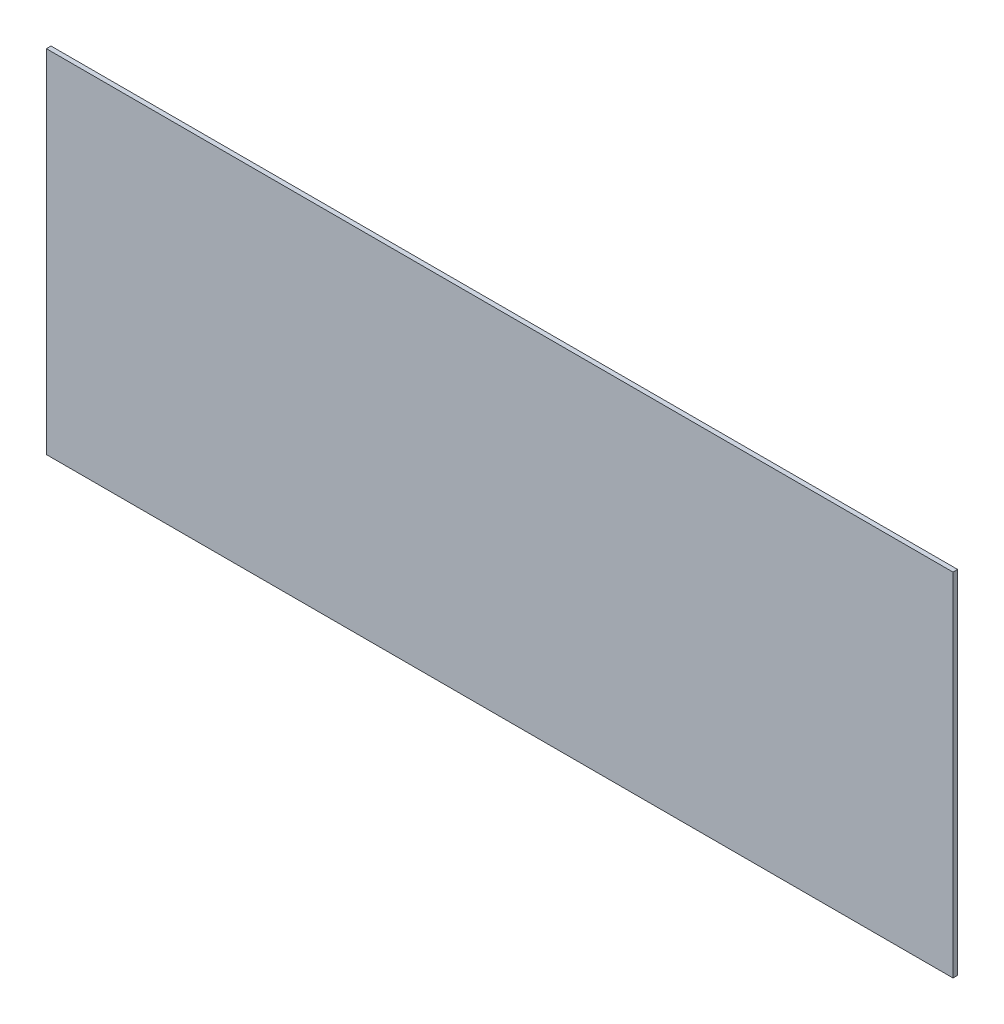
ISO-10303-21;
HEADER;
FILE_DESCRIPTION(('STEP AP214'),'2;1');
FILE_NAME('part.step','',(''),(''),'','','');
FILE_SCHEMA(('AUTOMOTIVE_DESIGN { 1 0 10303 214 1 1 1 1 }'));
ENDSEC;
DATA;
#1=APPLICATION_CONTEXT('core data for automotive mechanical design processes');
#2=APPLICATION_PROTOCOL_DEFINITION('international standard','automotive_design',2000,#1);
#3=PRODUCT_CONTEXT('',#1,'mechanical');
#4=PRODUCT('Part','Part','',(#3));
#5=PRODUCT_RELATED_PRODUCT_CATEGORY('part','',(#4));
#6=PRODUCT_DEFINITION_FORMATION('','',#4);
#7=PRODUCT_DEFINITION_CONTEXT('part definition',#1,'design');
#8=PRODUCT_DEFINITION('design','',#6,#7);
#9=PRODUCT_DEFINITION_SHAPE('','',#8);
#10=(LENGTH_UNIT() NAMED_UNIT(*) SI_UNIT(.MILLI.,.METRE.));
#11=(NAMED_UNIT(*) PLANE_ANGLE_UNIT() SI_UNIT($,.RADIAN.));
#12=(NAMED_UNIT(*) SI_UNIT($,.STERADIAN.) SOLID_ANGLE_UNIT());
#13=UNCERTAINTY_MEASURE_WITH_UNIT(LENGTH_MEASURE(1.E-05),#10,'distance_accuracy_value','');
#14=(GEOMETRIC_REPRESENTATION_CONTEXT(3) GLOBAL_UNCERTAINTY_ASSIGNED_CONTEXT((#13)) GLOBAL_UNIT_ASSIGNED_CONTEXT((#10,
#11,#12)) REPRESENTATION_CONTEXT('',''));
#15=CARTESIAN_POINT('',(0.,0.,0.));
#16=DIRECTION('',(0.,0.,1.));
#17=DIRECTION('',(1.,0.,0.));
#18=AXIS2_PLACEMENT_3D('',#15,#16,#17);
#19=CARTESIAN_POINT('',(0.,0.,6.35));
#20=DIRECTION('',(0.,0.,1.));
#21=DIRECTION('',(1.,0.,0.));
#22=AXIS2_PLACEMENT_3D('',#19,#20,#21);
#23=PLANE('',#22);
#24=DIRECTION('',(1.,0.,0.));
#25=VECTOR('',#24,1.);
#26=CARTESIAN_POINT('',(1244.6,482.6,6.35));
#27=LINE('',#26,#25);
#28=CARTESIAN_POINT('',(0.,482.6,6.35));
#29=VERTEX_POINT('',#28);
#30=CARTESIAN_POINT('',(1244.6,482.6,6.35));
#31=VERTEX_POINT('',#30);
#32=EDGE_CURVE('E74',#29,#31,#27,.T.);
#33=ORIENTED_EDGE('',*,*,#32,.F.);
#34=DIRECTION('',(0.,1.,0.));
#35=VECTOR('',#34,1.);
#36=CARTESIAN_POINT('',(0.,482.6,6.35));
#37=LINE('',#36,#35);
#38=CARTESIAN_POINT('',(0.,0.,6.35));
#39=VERTEX_POINT('',#38);
#40=EDGE_CURVE('E69',#39,#29,#37,.T.);
#41=ORIENTED_EDGE('',*,*,#40,.F.);
#42=DIRECTION('',(1.,0.,0.));
#43=VECTOR('',#42,1.);
#44=CARTESIAN_POINT('',(0.,0.,6.35));
#45=LINE('',#44,#43);
#46=CARTESIAN_POINT('',(1244.6,0.,6.35));
#47=VERTEX_POINT('',#46);
#48=EDGE_CURVE('E84',#47,#39,#45,.F.);
#49=ORIENTED_EDGE('',*,*,#48,.F.);
#50=DIRECTION('',(0.,1.,0.));
#51=VECTOR('',#50,1.);
#52=CARTESIAN_POINT('',(1244.6,0.,6.35));
#53=LINE('',#52,#51);
#54=EDGE_CURVE('E36',#31,#47,#53,.F.);
#55=ORIENTED_EDGE('',*,*,#54,.F.);
#56=EDGE_LOOP('',(#33,#41,#49,#55));
#57=FACE_BOUND('',#56,.T.);
#58=ADVANCED_FACE('F33',(#57),#23,.T.);
#59=CARTESIAN_POINT('',(1244.6,0.,0.));
#60=DIRECTION('',(1.,0.,0.));
#61=DIRECTION('',(0.,0.,-1.));
#62=AXIS2_PLACEMENT_3D('',#59,#60,#61);
#63=PLANE('',#62);
#64=ORIENTED_EDGE('',*,*,#54,.T.);
#65=DIRECTION('',(0.,0.,-1.));
#66=VECTOR('',#65,1.);
#67=CARTESIAN_POINT('',(1244.6,0.,0.));
#68=LINE('',#67,#66);
#69=CARTESIAN_POINT('',(1244.6,0.,0.));
#70=VERTEX_POINT('',#69);
#71=EDGE_CURVE('E95',#70,#47,#68,.F.);
#72=ORIENTED_EDGE('',*,*,#71,.F.);
#73=DIRECTION('',(0.,1.,0.));
#74=VECTOR('',#73,1.);
#75=CARTESIAN_POINT('',(1244.6,0.,0.));
#76=LINE('',#75,#74);
#77=CARTESIAN_POINT('',(1244.6,482.6,0.));
#78=VERTEX_POINT('',#77);
#79=EDGE_CURVE('E90',#70,#78,#76,.T.);
#80=ORIENTED_EDGE('',*,*,#79,.T.);
#81=DIRECTION('',(0.,0.,1.));
#82=VECTOR('',#81,1.);
#83=CARTESIAN_POINT('',(1244.6,482.6,0.));
#84=LINE('',#83,#82);
#85=EDGE_CURVE('E79',#31,#78,#84,.F.);
#86=ORIENTED_EDGE('',*,*,#85,.F.);
#87=EDGE_LOOP('',(#64,#72,#80,#86));
#88=FACE_BOUND('',#87,.T.);
#89=ADVANCED_FACE('F89',(#88),#63,.T.);
#90=CARTESIAN_POINT('',(1244.6,482.6,0.));
#91=DIRECTION('',(0.,1.,0.));
#92=DIRECTION('',(0.,0.,1.));
#93=AXIS2_PLACEMENT_3D('',#90,#91,#92);
#94=PLANE('',#93);
#95=ORIENTED_EDGE('',*,*,#32,.T.);
#96=ORIENTED_EDGE('',*,*,#85,.T.);
#97=DIRECTION('',(1.,0.,0.));
#98=VECTOR('',#97,1.);
#99=CARTESIAN_POINT('',(0.,482.6,0.));
#100=LINE('',#99,#98);
#101=CARTESIAN_POINT('',(0.,482.6,0.));
#102=VERTEX_POINT('',#101);
#103=EDGE_CURVE('E100',#78,#102,#100,.F.);
#104=ORIENTED_EDGE('',*,*,#103,.T.);
#105=DIRECTION('',(0.,0.,1.));
#106=VECTOR('',#105,1.);
#107=CARTESIAN_POINT('',(0.,482.6,0.));
#108=LINE('',#107,#106);
#109=EDGE_CURVE('E81',#29,#102,#108,.F.);
#110=ORIENTED_EDGE('',*,*,#109,.F.);
#111=EDGE_LOOP('',(#95,#96,#104,#110));
#112=FACE_BOUND('',#111,.T.);
#113=ADVANCED_FACE('F76',(#112),#94,.T.);
#114=CARTESIAN_POINT('',(0.,482.6,0.));
#115=DIRECTION('',(-1.,0.,0.));
#116=DIRECTION('',(0.,0.,1.));
#117=AXIS2_PLACEMENT_3D('',#114,#115,#116);
#118=PLANE('',#117);
#119=ORIENTED_EDGE('',*,*,#40,.T.);
#120=ORIENTED_EDGE('',*,*,#109,.T.);
#121=DIRECTION('',(0.,1.,0.));
#122=VECTOR('',#121,1.);
#123=CARTESIAN_POINT('',(0.,0.,0.));
#124=LINE('',#123,#122);
#125=CARTESIAN_POINT('',(0.,0.,0.));
#126=VERTEX_POINT('',#125);
#127=EDGE_CURVE('E42',#102,#126,#124,.F.);
#128=ORIENTED_EDGE('',*,*,#127,.T.);
#129=DIRECTION('',(0.,0.,-1.));
#130=VECTOR('',#129,1.);
#131=CARTESIAN_POINT('',(0.,0.,0.));
#132=LINE('',#131,#130);
#133=EDGE_CURVE('E50',#39,#126,#132,.T.);
#134=ORIENTED_EDGE('',*,*,#133,.F.);
#135=EDGE_LOOP('',(#119,#120,#128,#134));
#136=FACE_BOUND('',#135,.T.);
#137=ADVANCED_FACE('F104',(#136),#118,.T.);
#138=CARTESIAN_POINT('',(0.,0.,0.));
#139=DIRECTION('',(0.,-1.,0.));
#140=DIRECTION('',(0.,0.,-1.));
#141=AXIS2_PLACEMENT_3D('',#138,#139,#140);
#142=PLANE('',#141);
#143=ORIENTED_EDGE('',*,*,#48,.T.);
#144=ORIENTED_EDGE('',*,*,#133,.T.);
#145=DIRECTION('',(1.,0.,0.));
#146=VECTOR('',#145,1.);
#147=CARTESIAN_POINT('',(0.,0.,0.));
#148=LINE('',#147,#146);
#149=EDGE_CURVE('E11',#126,#70,#148,.T.);
#150=ORIENTED_EDGE('',*,*,#149,.T.);
#151=ORIENTED_EDGE('',*,*,#71,.T.);
#152=EDGE_LOOP('',(#143,#144,#150,#151));
#153=FACE_BOUND('',#152,.T.);
#154=ADVANCED_FACE('F107',(#153),#142,.T.);
#155=CARTESIAN_POINT('',(0.,0.,0.));
#156=DIRECTION('',(0.,0.,1.));
#157=DIRECTION('',(1.,0.,0.));
#158=AXIS2_PLACEMENT_3D('',#155,#156,#157);
#159=PLANE('',#158);
#160=ORIENTED_EDGE('',*,*,#127,.F.);
#161=ORIENTED_EDGE('',*,*,#103,.F.);
#162=ORIENTED_EDGE('',*,*,#79,.F.);
#163=ORIENTED_EDGE('',*,*,#149,.F.);
#164=EDGE_LOOP('',(#160,#161,#162,#163));
#165=FACE_BOUND('',#164,.T.);
#166=ADVANCED_FACE('F106',(#165),#159,.F.);
#167=CLOSED_SHELL('',(#58,#89,#113,#137,#154,#166));
#168=MANIFOLD_SOLID_BREP('B2',#167);
#169=ADVANCED_BREP_SHAPE_REPRESENTATION('',(#18,#168),#14);
#170=SHAPE_DEFINITION_REPRESENTATION(#9,#169);
ENDSEC;
END-ISO-10303-21;
